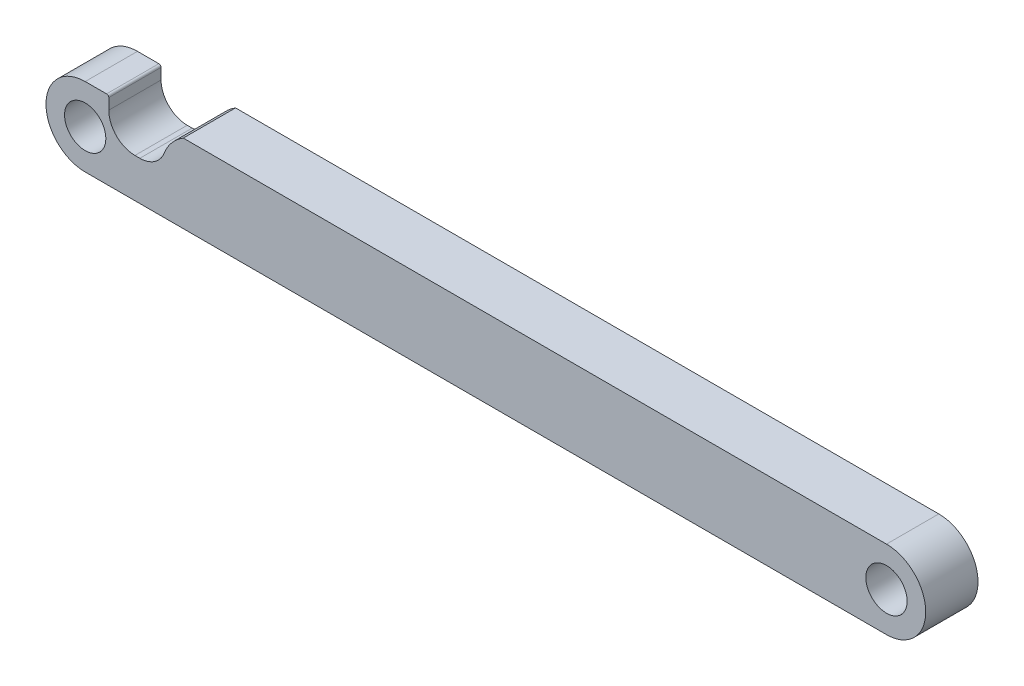
ISO-10303-21;
HEADER;
FILE_DESCRIPTION(('STEP AP214'),'2;1');
FILE_NAME('part.step','',(''),(''),'','','');
FILE_SCHEMA(('AUTOMOTIVE_DESIGN { 1 0 10303 214 1 1 1 1 }'));
ENDSEC;
DATA;
#1=APPLICATION_CONTEXT('core data for automotive mechanical design processes');
#2=APPLICATION_PROTOCOL_DEFINITION('international standard','automotive_design',2000,#1);
#3=PRODUCT_CONTEXT('',#1,'mechanical');
#4=PRODUCT('Part','Part','',(#3));
#5=PRODUCT_RELATED_PRODUCT_CATEGORY('part','',(#4));
#6=PRODUCT_DEFINITION_FORMATION('','',#4);
#7=PRODUCT_DEFINITION_CONTEXT('part definition',#1,'design');
#8=PRODUCT_DEFINITION('design','',#6,#7);
#9=PRODUCT_DEFINITION_SHAPE('','',#8);
#10=(LENGTH_UNIT() NAMED_UNIT(*) SI_UNIT(.MILLI.,.METRE.));
#11=(NAMED_UNIT(*) PLANE_ANGLE_UNIT() SI_UNIT($,.RADIAN.));
#12=(NAMED_UNIT(*) SI_UNIT($,.STERADIAN.) SOLID_ANGLE_UNIT());
#13=UNCERTAINTY_MEASURE_WITH_UNIT(LENGTH_MEASURE(1.E-05),#10,'distance_accuracy_value','');
#14=(GEOMETRIC_REPRESENTATION_CONTEXT(3) GLOBAL_UNCERTAINTY_ASSIGNED_CONTEXT((#13)) GLOBAL_UNIT_ASSIGNED_CONTEXT((#10,
#11,#12)) REPRESENTATION_CONTEXT('',''));
#15=CARTESIAN_POINT('',(0.,0.,0.));
#16=DIRECTION('',(0.,0.,1.));
#17=DIRECTION('',(1.,0.,0.));
#18=AXIS2_PLACEMENT_3D('',#15,#16,#17);
#19=CARTESIAN_POINT('',(-62.3524230708239,33.1181907196704,6.35));
#20=DIRECTION('',(0.,0.,1.));
#21=DIRECTION('',(1.,0.,0.));
#22=AXIS2_PLACEMENT_3D('',#19,#20,#21);
#23=PLANE('',#22);
#24=CARTESIAN_POINT('',(-64.9643695165803,28.6130693201748,6.35));
#25=DIRECTION('',(0.,0.,1.));
#26=DIRECTION('',(1.,0.,0.));
#27=AXIS2_PLACEMENT_3D('',#24,#25,#26);
#28=CIRCLE('',#27,2.50825000000001);
#29=CARTESIAN_POINT('',(-62.4561195165803,28.6130693201748,6.35));
#30=VERTEX_POINT('',#29);
#31=EDGE_CURVE('E152',#30,#30,#28,.T.);
#32=ORIENTED_EDGE('',*,*,#31,.F.);
#33=EDGE_LOOP('',(#32));
#34=FACE_BOUND('',#33,.T.);
#35=CARTESIAN_POINT('',(-62.3524230708239,33.1181907196704,6.35));
#36=DIRECTION('',(0.,0.,1.));
#37=DIRECTION('',(1.,0.,0.));
#38=AXIS2_PLACEMENT_3D('',#35,#36,#37);
#39=CIRCLE('',#38,0.253999999999998);
#40=CARTESIAN_POINT('',(-62.0984230708239,33.1181907196704,6.35));
#41=VERTEX_POINT('',#40);
#42=CARTESIAN_POINT('',(-62.3667329299788,33.3717873046848,6.35));
#43=VERTEX_POINT('',#42);
#44=EDGE_CURVE('E170',#41,#43,#39,.T.);
#45=ORIENTED_EDGE('',*,*,#44,.T.);
#46=DIRECTION('',(-1.,0.,0.));
#47=VECTOR('',#46,1.);
#48=CARTESIAN_POINT('',(-62.3667329299788,33.3717873046848,6.35));
#49=LINE('',#48,#47);
#50=CARTESIAN_POINT('',(-64.9643695165803,33.3717873046848,6.35));
#51=VERTEX_POINT('',#50);
#52=EDGE_CURVE('E102',#43,#51,#49,.T.);
#53=ORIENTED_EDGE('',*,*,#52,.T.);
#54=CARTESIAN_POINT('',(-64.9643695165803,28.6130693201748,6.35));
#55=DIRECTION('',(0.,0.,1.));
#56=DIRECTION('',(1.,0.,0.));
#57=AXIS2_PLACEMENT_3D('',#54,#55,#56);
#58=CIRCLE('',#57,4.75871798451001);
#59=CARTESIAN_POINT('',(-64.9643695165803,23.8543513356648,6.35));
#60=VERTEX_POINT('',#59);
#61=EDGE_CURVE('E194',#51,#60,#58,.T.);
#62=ORIENTED_EDGE('',*,*,#61,.T.);
#63=DIRECTION('',(1.,0.,0.));
#64=VECTOR('',#63,1.);
#65=CARTESIAN_POINT('',(32.3578269291761,23.8543513356648,6.35));
#66=LINE('',#65,#64);
#67=CARTESIAN_POINT('',(32.3578269291761,23.8543513356648,6.35));
#68=VERTEX_POINT('',#67);
#69=EDGE_CURVE('E212',#60,#68,#66,.T.);
#70=ORIENTED_EDGE('',*,*,#69,.T.);
#71=CARTESIAN_POINT('',(32.3578269291761,28.6168513356648,6.35));
#72=DIRECTION('',(0.,0.,1.));
#73=DIRECTION('',(1.,0.,0.));
#74=AXIS2_PLACEMENT_3D('',#71,#72,#73);
#75=CIRCLE('',#74,4.76249999999999);
#76=CARTESIAN_POINT('',(32.3578269291761,33.3793513356648,6.35));
#77=VERTEX_POINT('',#76);
#78=EDGE_CURVE('E209',#68,#77,#75,.T.);
#79=ORIENTED_EDGE('',*,*,#78,.T.);
#80=DIRECTION('',(-1.,0.,0.));
#81=VECTOR('',#80,1.);
#82=CARTESIAN_POINT('',(32.3578269291761,33.3793513356648,6.35));
#83=LINE('',#82,#81);
#84=CARTESIAN_POINT('',(-53.0540793957234,33.3793513356648,6.35));
#85=VERTEX_POINT('',#84);
#86=EDGE_CURVE('E211',#77,#85,#83,.T.);
#87=ORIENTED_EDGE('',*,*,#86,.T.);
#88=CARTESIAN_POINT('',(-50.1921730708239,28.6168513356648,6.35));
#89=DIRECTION('',(0.,0.,1.));
#90=DIRECTION('',(1.,0.,0.));
#91=AXIS2_PLACEMENT_3D('',#88,#89,#90);
#92=CIRCLE('',#91,5.55625);
#93=CARTESIAN_POINT('',(-55.3680476338569,30.6373058811193,6.35));
#94=VERTEX_POINT('',#93);
#95=EDGE_CURVE('E214',#85,#94,#92,.T.);
#96=ORIENTED_EDGE('',*,*,#95,.T.);
#97=CARTESIAN_POINT('',(-58.3256902413043,31.7918513356648,6.35));
#98=DIRECTION('',(0.,0.,-1.));
#99=DIRECTION('',(1.,0.,0.));
#100=AXIS2_PLACEMENT_3D('',#97,#98,#99);
#101=CIRCLE('',#100,3.175);
#102=CARTESIAN_POINT('',(-58.3256902413043,28.6168513356648,6.35));
#103=VERTEX_POINT('',#102);
#104=EDGE_CURVE('E130',#94,#103,#101,.T.);
#105=ORIENTED_EDGE('',*,*,#104,.T.);
#106=DIRECTION('',(-1.,0.,0.));
#107=VECTOR('',#106,1.);
#108=CARTESIAN_POINT('',(-58.9234230708239,28.6168513356648,6.35));
#109=LINE('',#108,#107);
#110=CARTESIAN_POINT('',(-58.9234230708239,28.6168513356648,6.35));
#111=VERTEX_POINT('',#110);
#112=EDGE_CURVE('E124',#103,#111,#109,.T.);
#113=ORIENTED_EDGE('',*,*,#112,.T.);
#114=CARTESIAN_POINT('',(-58.9234230708239,31.7918513356648,6.35));
#115=DIRECTION('',(0.,0.,-1.));
#116=DIRECTION('',(1.,0.,0.));
#117=AXIS2_PLACEMENT_3D('',#114,#115,#116);
#118=CIRCLE('',#117,3.175);
#119=CARTESIAN_POINT('',(-62.0984230708239,31.7918513356648,6.35));
#120=VERTEX_POINT('',#119);
#121=EDGE_CURVE('E128',#111,#120,#118,.T.);
#122=ORIENTED_EDGE('',*,*,#121,.T.);
#123=DIRECTION('',(0.,1.,0.));
#124=VECTOR('',#123,1.);
#125=CARTESIAN_POINT('',(-62.0984230708239,33.1181907196704,6.35));
#126=LINE('',#125,#124);
#127=EDGE_CURVE('E50',#120,#41,#126,.T.);
#128=ORIENTED_EDGE('',*,*,#127,.T.);
#129=EDGE_LOOP('',(#45,#53,#62,#70,#79,#87,#96,#105,#113,#122,#128));
#130=FACE_BOUND('',#129,.T.);
#131=CARTESIAN_POINT('',(32.3578269291761,28.6168513356648,6.35));
#132=DIRECTION('',(0.,0.,1.));
#133=DIRECTION('',(1.,0.,0.));
#134=AXIS2_PLACEMENT_3D('',#131,#132,#133);
#135=CIRCLE('',#134,2.50825000000001);
#136=CARTESIAN_POINT('',(34.8660769291761,28.6168513356648,6.35));
#137=VERTEX_POINT('',#136);
#138=EDGE_CURVE('E259',#137,#137,#135,.T.);
#139=ORIENTED_EDGE('',*,*,#138,.F.);
#140=EDGE_LOOP('',(#139));
#141=FACE_BOUND('',#140,.T.);
#142=ADVANCED_FACE('F33',(#34,#130,#141),#23,.T.);
#143=CARTESIAN_POINT('',(-62.3524230708239,33.1181907196704,0.));
#144=DIRECTION('',(0.,0.,1.));
#145=DIRECTION('',(1.,0.,0.));
#146=AXIS2_PLACEMENT_3D('',#143,#144,#145);
#147=PLANE('',#146);
#148=CARTESIAN_POINT('',(-62.3524230708239,33.1181907196704,0.));
#149=DIRECTION('',(0.,0.,1.));
#150=DIRECTION('',(1.,0.,0.));
#151=AXIS2_PLACEMENT_3D('',#148,#149,#150);
#152=CIRCLE('',#151,0.253999999999998);
#153=CARTESIAN_POINT('',(-62.0984230708239,33.1181907196704,0.));
#154=VERTEX_POINT('',#153);
#155=CARTESIAN_POINT('',(-62.3667329299788,33.3717873046848,0.));
#156=VERTEX_POINT('',#155);
#157=EDGE_CURVE('E148',#154,#156,#152,.T.);
#158=ORIENTED_EDGE('',*,*,#157,.F.);
#159=DIRECTION('',(0.,1.,0.));
#160=VECTOR('',#159,1.);
#161=CARTESIAN_POINT('',(-62.0984230708239,33.1181907196704,0.));
#162=LINE('',#161,#160);
#163=CARTESIAN_POINT('',(-62.0984230708239,31.7918513356648,0.));
#164=VERTEX_POINT('',#163);
#165=EDGE_CURVE('E94',#164,#154,#162,.T.);
#166=ORIENTED_EDGE('',*,*,#165,.F.);
#167=CARTESIAN_POINT('',(-58.9234230708239,31.7918513356648,0.));
#168=DIRECTION('',(0.,0.,-1.));
#169=DIRECTION('',(1.,0.,0.));
#170=AXIS2_PLACEMENT_3D('',#167,#168,#169);
#171=CIRCLE('',#170,3.175);
#172=CARTESIAN_POINT('',(-58.9234230708239,28.6168513356648,0.));
#173=VERTEX_POINT('',#172);
#174=EDGE_CURVE('E88',#173,#164,#171,.T.);
#175=ORIENTED_EDGE('',*,*,#174,.F.);
#176=DIRECTION('',(-1.,0.,0.));
#177=VECTOR('',#176,1.);
#178=CARTESIAN_POINT('',(-58.9234230708239,28.6168513356648,0.));
#179=LINE('',#178,#177);
#180=CARTESIAN_POINT('',(-58.3256902413043,28.6168513356648,0.));
#181=VERTEX_POINT('',#180);
#182=EDGE_CURVE('E138',#181,#173,#179,.T.);
#183=ORIENTED_EDGE('',*,*,#182,.F.);
#184=CARTESIAN_POINT('',(-58.3256902413043,31.7918513356648,0.));
#185=DIRECTION('',(0.,0.,-1.));
#186=DIRECTION('',(1.,0.,0.));
#187=AXIS2_PLACEMENT_3D('',#184,#185,#186);
#188=CIRCLE('',#187,3.175);
#189=CARTESIAN_POINT('',(-55.3680476338569,30.6373058811193,0.));
#190=VERTEX_POINT('',#189);
#191=EDGE_CURVE('E165',#190,#181,#188,.T.);
#192=ORIENTED_EDGE('',*,*,#191,.F.);
#193=CARTESIAN_POINT('',(-50.1921730708239,28.6168513356648,0.));
#194=DIRECTION('',(0.,0.,1.));
#195=DIRECTION('',(1.,0.,0.));
#196=AXIS2_PLACEMENT_3D('',#193,#194,#195);
#197=CIRCLE('',#196,5.55625);
#198=CARTESIAN_POINT('',(-53.0540793957234,33.3793513356648,0.));
#199=VERTEX_POINT('',#198);
#200=EDGE_CURVE('E163',#199,#190,#197,.T.);
#201=ORIENTED_EDGE('',*,*,#200,.F.);
#202=DIRECTION('',(-1.,0.,0.));
#203=VECTOR('',#202,1.);
#204=CARTESIAN_POINT('',(32.3578269291761,33.3793513356648,0.));
#205=LINE('',#204,#203);
#206=CARTESIAN_POINT('',(32.3578269291761,33.3793513356648,0.));
#207=VERTEX_POINT('',#206);
#208=EDGE_CURVE('E161',#207,#199,#205,.T.);
#209=ORIENTED_EDGE('',*,*,#208,.F.);
#210=CARTESIAN_POINT('',(32.3578269291761,28.6168513356648,0.));
#211=DIRECTION('',(0.,0.,1.));
#212=DIRECTION('',(1.,0.,0.));
#213=AXIS2_PLACEMENT_3D('',#210,#211,#212);
#214=CIRCLE('',#213,4.7625);
#215=CARTESIAN_POINT('',(32.3578269291761,23.8543513356648,0.));
#216=VERTEX_POINT('',#215);
#217=EDGE_CURVE('E159',#216,#207,#214,.T.);
#218=ORIENTED_EDGE('',*,*,#217,.F.);
#219=DIRECTION('',(1.,0.,0.));
#220=VECTOR('',#219,1.);
#221=CARTESIAN_POINT('',(32.3578269291761,23.8543513356648,0.));
#222=LINE('',#221,#220);
#223=CARTESIAN_POINT('',(-64.9643695165803,23.8543513356648,0.));
#224=VERTEX_POINT('',#223);
#225=EDGE_CURVE('E156',#224,#216,#222,.T.);
#226=ORIENTED_EDGE('',*,*,#225,.F.);
#227=CARTESIAN_POINT('',(-64.9643695165803,28.6130693201748,0.));
#228=DIRECTION('',(0.,0.,1.));
#229=DIRECTION('',(1.,0.,0.));
#230=AXIS2_PLACEMENT_3D('',#227,#228,#229);
#231=CIRCLE('',#230,4.75871798451001);
#232=CARTESIAN_POINT('',(-64.9643695165803,33.3717873046848,0.));
#233=VERTEX_POINT('',#232);
#234=EDGE_CURVE('E154',#233,#224,#231,.T.);
#235=ORIENTED_EDGE('',*,*,#234,.F.);
#236=DIRECTION('',(-1.,0.,0.));
#237=VECTOR('',#236,1.);
#238=CARTESIAN_POINT('',(-62.3667329299788,33.3717873046848,0.));
#239=LINE('',#238,#237);
#240=EDGE_CURVE('E151',#156,#233,#239,.T.);
#241=ORIENTED_EDGE('',*,*,#240,.F.);
#242=EDGE_LOOP('',(#158,#166,#175,#183,#192,#201,#209,#218,#226,#235,#241));
#243=FACE_BOUND('',#242,.T.);
#244=CARTESIAN_POINT('',(-64.9643695165803,28.6130693201748,0.));
#245=DIRECTION('',(0.,0.,1.));
#246=DIRECTION('',(1.,0.,0.));
#247=AXIS2_PLACEMENT_3D('',#244,#245,#246);
#248=CIRCLE('',#247,2.50825000000001);
#249=CARTESIAN_POINT('',(-62.4561195165803,28.6130693201748,0.));
#250=VERTEX_POINT('',#249);
#251=EDGE_CURVE('E265',#250,#250,#248,.T.);
#252=ORIENTED_EDGE('',*,*,#251,.T.);
#253=EDGE_LOOP('',(#252));
#254=FACE_BOUND('',#253,.T.);
#255=CARTESIAN_POINT('',(32.3578269291761,28.6168513356648,0.));
#256=DIRECTION('',(0.,0.,1.));
#257=DIRECTION('',(1.,0.,0.));
#258=AXIS2_PLACEMENT_3D('',#255,#256,#257);
#259=CIRCLE('',#258,2.50825000000001);
#260=CARTESIAN_POINT('',(34.8660769291761,28.6168513356648,0.));
#261=VERTEX_POINT('',#260);
#262=EDGE_CURVE('E262',#261,#261,#259,.T.);
#263=ORIENTED_EDGE('',*,*,#262,.T.);
#264=EDGE_LOOP('',(#263));
#265=FACE_BOUND('',#264,.T.);
#266=ADVANCED_FACE('F198',(#243,#254,#265),#147,.F.);
#267=CARTESIAN_POINT('',(-62.3524230708239,33.1181907196704,6.35));
#268=DIRECTION('',(0.,0.,-1.));
#269=DIRECTION('',(-1.,0.,0.));
#270=AXIS2_PLACEMENT_3D('',#267,#268,#269);
#271=CYLINDRICAL_SURFACE('',#270,0.253999999999998);
#272=ORIENTED_EDGE('',*,*,#157,.T.);
#273=DIRECTION('',(0.,0.,-1.));
#274=VECTOR('',#273,1.);
#275=CARTESIAN_POINT('',(-62.3667329299788,33.3717873046848,6.35));
#276=LINE('',#275,#274);
#277=EDGE_CURVE('E11',#43,#156,#276,.T.);
#278=ORIENTED_EDGE('',*,*,#277,.F.);
#279=ORIENTED_EDGE('',*,*,#44,.F.);
#280=DIRECTION('',(0.,0.,-1.));
#281=VECTOR('',#280,1.);
#282=CARTESIAN_POINT('',(-62.0984230708239,33.1181907196704,6.35));
#283=LINE('',#282,#281);
#284=EDGE_CURVE('E144',#41,#154,#283,.T.);
#285=ORIENTED_EDGE('',*,*,#284,.T.);
#286=EDGE_LOOP('',(#272,#278,#279,#285));
#287=FACE_BOUND('',#286,.T.);
#288=ADVANCED_FACE('F35',(#287),#271,.T.);
#289=CARTESIAN_POINT('',(-62.3667329299788,33.3717873046848,6.35));
#290=DIRECTION('',(0.,-1.,0.));
#291=DIRECTION('',(0.,0.,-1.));
#292=AXIS2_PLACEMENT_3D('',#289,#290,#291);
#293=PLANE('',#292);
#294=ORIENTED_EDGE('',*,*,#240,.T.);
#295=DIRECTION('',(0.,0.,-1.));
#296=VECTOR('',#295,1.);
#297=CARTESIAN_POINT('',(-64.9643695165803,33.3717873046848,6.35));
#298=LINE('',#297,#296);
#299=EDGE_CURVE('E42',#51,#233,#298,.T.);
#300=ORIENTED_EDGE('',*,*,#299,.F.);
#301=ORIENTED_EDGE('',*,*,#52,.F.);
#302=ORIENTED_EDGE('',*,*,#277,.T.);
#303=EDGE_LOOP('',(#294,#300,#301,#302));
#304=FACE_BOUND('',#303,.T.);
#305=ADVANCED_FACE('F349',(#304),#293,.F.);
#306=CARTESIAN_POINT('',(-64.9643695165803,28.6130693201748,6.35));
#307=DIRECTION('',(0.,0.,-1.));
#308=DIRECTION('',(-1.,0.,0.));
#309=AXIS2_PLACEMENT_3D('',#306,#307,#308);
#310=CYLINDRICAL_SURFACE('',#309,4.75871798451001);
#311=ORIENTED_EDGE('',*,*,#234,.T.);
#312=DIRECTION('',(0.,0.,-1.));
#313=VECTOR('',#312,1.);
#314=CARTESIAN_POINT('',(-64.9643695165803,23.8543513356648,6.35));
#315=LINE('',#314,#313);
#316=EDGE_CURVE('E186',#60,#224,#315,.T.);
#317=ORIENTED_EDGE('',*,*,#316,.F.);
#318=ORIENTED_EDGE('',*,*,#61,.F.);
#319=ORIENTED_EDGE('',*,*,#299,.T.);
#320=EDGE_LOOP('',(#311,#317,#318,#319));
#321=FACE_BOUND('',#320,.T.);
#322=ADVANCED_FACE('F192',(#321),#310,.T.);
#323=CARTESIAN_POINT('',(32.3578269291761,23.8543513356648,6.35));
#324=DIRECTION('',(0.,1.,0.));
#325=DIRECTION('',(-1.,0.,0.));
#326=AXIS2_PLACEMENT_3D('',#323,#324,#325);
#327=PLANE('',#326);
#328=ORIENTED_EDGE('',*,*,#225,.T.);
#329=DIRECTION('',(0.,0.,-1.));
#330=VECTOR('',#329,1.);
#331=CARTESIAN_POINT('',(32.3578269291761,23.8543513356648,6.35));
#332=LINE('',#331,#330);
#333=EDGE_CURVE('E183',#68,#216,#332,.T.);
#334=ORIENTED_EDGE('',*,*,#333,.F.);
#335=ORIENTED_EDGE('',*,*,#69,.F.);
#336=ORIENTED_EDGE('',*,*,#316,.T.);
#337=EDGE_LOOP('',(#328,#334,#335,#336));
#338=FACE_BOUND('',#337,.T.);
#339=ADVANCED_FACE('F203',(#338),#327,.F.);
#340=CARTESIAN_POINT('',(32.3578269291761,28.6168513356648,6.35));
#341=DIRECTION('',(0.,0.,-1.));
#342=DIRECTION('',(-1.,0.,0.));
#343=AXIS2_PLACEMENT_3D('',#340,#341,#342);
#344=CYLINDRICAL_SURFACE('',#343,4.7625);
#345=ORIENTED_EDGE('',*,*,#217,.T.);
#346=DIRECTION('',(0.,0.,-1.));
#347=VECTOR('',#346,1.);
#348=CARTESIAN_POINT('',(32.3578269291761,33.3793513356648,6.35));
#349=LINE('',#348,#347);
#350=EDGE_CURVE('E180',#77,#207,#349,.T.);
#351=ORIENTED_EDGE('',*,*,#350,.F.);
#352=ORIENTED_EDGE('',*,*,#78,.F.);
#353=ORIENTED_EDGE('',*,*,#333,.T.);
#354=EDGE_LOOP('',(#345,#351,#352,#353));
#355=FACE_BOUND('',#354,.T.);
#356=ADVANCED_FACE('F207',(#355),#344,.T.);
#357=CARTESIAN_POINT('',(32.3578269291761,33.3793513356648,6.35));
#358=DIRECTION('',(0.,-1.,0.));
#359=DIRECTION('',(0.,0.,-1.));
#360=AXIS2_PLACEMENT_3D('',#357,#358,#359);
#361=PLANE('',#360);
#362=ORIENTED_EDGE('',*,*,#208,.T.);
#363=DIRECTION('',(0.,0.,-1.));
#364=VECTOR('',#363,1.);
#365=CARTESIAN_POINT('',(-53.0540793957234,33.3793513356648,6.35));
#366=LINE('',#365,#364);
#367=EDGE_CURVE('E177',#85,#199,#366,.T.);
#368=ORIENTED_EDGE('',*,*,#367,.F.);
#369=ORIENTED_EDGE('',*,*,#86,.F.);
#370=ORIENTED_EDGE('',*,*,#350,.T.);
#371=EDGE_LOOP('',(#362,#368,#369,#370));
#372=FACE_BOUND('',#371,.T.);
#373=ADVANCED_FACE('F314',(#372),#361,.F.);
#374=CARTESIAN_POINT('',(-50.1921730708239,28.6168513356648,6.35));
#375=DIRECTION('',(0.,0.,-1.));
#376=DIRECTION('',(-1.,0.,0.));
#377=AXIS2_PLACEMENT_3D('',#374,#375,#376);
#378=CYLINDRICAL_SURFACE('',#377,5.55625);
#379=ORIENTED_EDGE('',*,*,#200,.T.);
#380=DIRECTION('',(0.,0.,-1.));
#381=VECTOR('',#380,1.);
#382=CARTESIAN_POINT('',(-55.3680476338569,30.6373058811193,6.35));
#383=LINE('',#382,#381);
#384=EDGE_CURVE('E174',#94,#190,#383,.T.);
#385=ORIENTED_EDGE('',*,*,#384,.F.);
#386=ORIENTED_EDGE('',*,*,#95,.F.);
#387=ORIENTED_EDGE('',*,*,#367,.T.);
#388=EDGE_LOOP('',(#379,#385,#386,#387));
#389=FACE_BOUND('',#388,.T.);
#390=ADVANCED_FACE('F223',(#389),#378,.T.);
#391=CARTESIAN_POINT('',(-58.3256902413043,31.7918513356648,6.35));
#392=DIRECTION('',(0.,0.,-1.));
#393=DIRECTION('',(-1.,0.,0.));
#394=AXIS2_PLACEMENT_3D('',#391,#392,#393);
#395=CYLINDRICAL_SURFACE('',#394,3.175);
#396=ORIENTED_EDGE('',*,*,#191,.T.);
#397=DIRECTION('',(0.,0.,-1.));
#398=VECTOR('',#397,1.);
#399=CARTESIAN_POINT('',(-58.3256902413043,28.6168513356648,6.35));
#400=LINE('',#399,#398);
#401=EDGE_CURVE('E139',#103,#181,#400,.T.);
#402=ORIENTED_EDGE('',*,*,#401,.F.);
#403=ORIENTED_EDGE('',*,*,#104,.F.);
#404=ORIENTED_EDGE('',*,*,#384,.T.);
#405=EDGE_LOOP('',(#396,#402,#403,#404));
#406=FACE_BOUND('',#405,.T.);
#407=ADVANCED_FACE('F227',(#406),#395,.F.);
#408=CARTESIAN_POINT('',(-58.9234230708239,28.6168513356648,6.35));
#409=DIRECTION('',(0.,-1.,0.));
#410=DIRECTION('',(0.,0.,-1.));
#411=AXIS2_PLACEMENT_3D('',#408,#409,#410);
#412=PLANE('',#411);
#413=ORIENTED_EDGE('',*,*,#182,.T.);
#414=DIRECTION('',(0.,0.,-1.));
#415=VECTOR('',#414,1.);
#416=CARTESIAN_POINT('',(-58.9234230708239,28.6168513356648,6.35));
#417=LINE('',#416,#415);
#418=EDGE_CURVE('E135',#111,#173,#417,.T.);
#419=ORIENTED_EDGE('',*,*,#418,.F.);
#420=ORIENTED_EDGE('',*,*,#112,.F.);
#421=ORIENTED_EDGE('',*,*,#401,.T.);
#422=EDGE_LOOP('',(#413,#419,#420,#421));
#423=FACE_BOUND('',#422,.T.);
#424=ADVANCED_FACE('F136',(#423),#412,.F.);
#425=CARTESIAN_POINT('',(-58.9234230708239,31.7918513356648,6.35));
#426=DIRECTION('',(0.,0.,-1.));
#427=DIRECTION('',(-1.,0.,0.));
#428=AXIS2_PLACEMENT_3D('',#425,#426,#427);
#429=CYLINDRICAL_SURFACE('',#428,3.175);
#430=ORIENTED_EDGE('',*,*,#174,.T.);
#431=DIRECTION('',(0.,0.,-1.));
#432=VECTOR('',#431,1.);
#433=CARTESIAN_POINT('',(-62.0984230708239,31.7918513356648,6.35));
#434=LINE('',#433,#432);
#435=EDGE_CURVE('E140',#120,#164,#434,.T.);
#436=ORIENTED_EDGE('',*,*,#435,.F.);
#437=ORIENTED_EDGE('',*,*,#121,.F.);
#438=ORIENTED_EDGE('',*,*,#418,.T.);
#439=EDGE_LOOP('',(#430,#436,#437,#438));
#440=FACE_BOUND('',#439,.T.);
#441=ADVANCED_FACE('F142',(#440),#429,.F.);
#442=CARTESIAN_POINT('',(-62.0984230708239,33.1181907196704,6.35));
#443=DIRECTION('',(-1.,0.,0.));
#444=DIRECTION('',(0.,0.,1.));
#445=AXIS2_PLACEMENT_3D('',#442,#443,#444);
#446=PLANE('',#445);
#447=ORIENTED_EDGE('',*,*,#165,.T.);
#448=ORIENTED_EDGE('',*,*,#284,.F.);
#449=ORIENTED_EDGE('',*,*,#127,.F.);
#450=ORIENTED_EDGE('',*,*,#435,.T.);
#451=EDGE_LOOP('',(#447,#448,#449,#450));
#452=FACE_BOUND('',#451,.T.);
#453=ADVANCED_FACE('F231',(#452),#446,.F.);
#454=CARTESIAN_POINT('',(-64.9643695165803,28.6130693201748,6.35));
#455=DIRECTION('',(0.,0.,-1.));
#456=DIRECTION('',(-1.,0.,0.));
#457=AXIS2_PLACEMENT_3D('',#454,#455,#456);
#458=CYLINDRICAL_SURFACE('',#457,2.50825000000001);
#459=ORIENTED_EDGE('',*,*,#31,.T.);
#460=EDGE_LOOP('',(#459));
#461=FACE_BOUND('',#460,.T.);
#462=ORIENTED_EDGE('',*,*,#251,.F.);
#463=EDGE_LOOP('',(#462));
#464=FACE_BOUND('',#463,.T.);
#465=ADVANCED_FACE('F233',(#461,#464),#458,.F.);
#466=CARTESIAN_POINT('',(32.3578269291761,28.6168513356648,6.35));
#467=DIRECTION('',(0.,0.,-1.));
#468=DIRECTION('',(-1.,0.,0.));
#469=AXIS2_PLACEMENT_3D('',#466,#467,#468);
#470=CYLINDRICAL_SURFACE('',#469,2.50825000000001);
#471=ORIENTED_EDGE('',*,*,#138,.T.);
#472=EDGE_LOOP('',(#471));
#473=FACE_BOUND('',#472,.T.);
#474=ORIENTED_EDGE('',*,*,#262,.F.);
#475=EDGE_LOOP('',(#474));
#476=FACE_BOUND('',#475,.T.);
#477=ADVANCED_FACE('F239',(#473,#476),#470,.F.);
#478=CLOSED_SHELL('',(#142,#266,#288,#305,#322,#339,#356,#373,#390,#407,#424,#441,#453,#465,#477));
#479=MANIFOLD_SOLID_BREP('B2',#478);
#480=ADVANCED_BREP_SHAPE_REPRESENTATION('',(#18,#479),#14);
#481=SHAPE_DEFINITION_REPRESENTATION(#9,#480);
ENDSEC;
END-ISO-10303-21;
